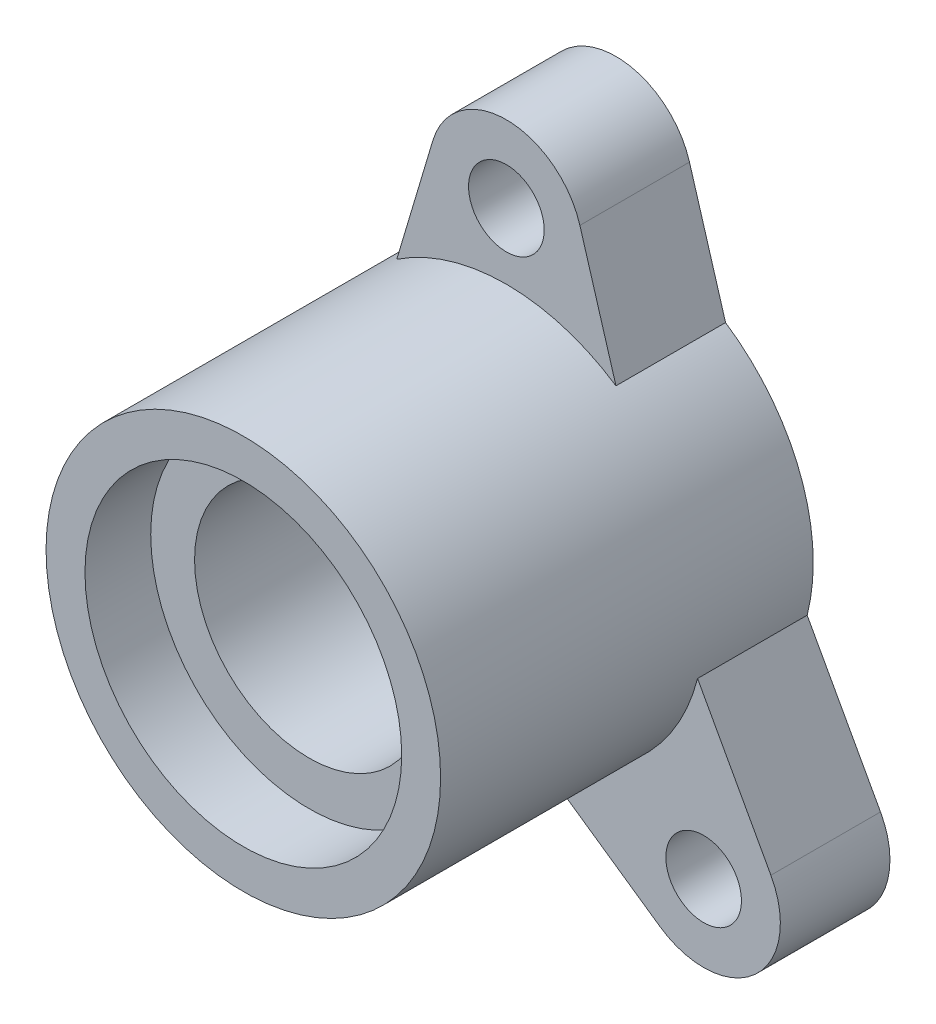
ISO-10303-21;
HEADER;
FILE_DESCRIPTION(('STEP AP214'),'2;1');
FILE_NAME('part.step','',(''),(''),'','','');
FILE_SCHEMA(('AUTOMOTIVE_DESIGN { 1 0 10303 214 1 1 1 1 }'));
ENDSEC;
DATA;
#1=APPLICATION_CONTEXT('core data for automotive mechanical design processes');
#2=APPLICATION_PROTOCOL_DEFINITION('international standard','automotive_design',2000,#1);
#3=PRODUCT_CONTEXT('',#1,'mechanical');
#4=PRODUCT('Part','Part','',(#3));
#5=PRODUCT_RELATED_PRODUCT_CATEGORY('part','',(#4));
#6=PRODUCT_DEFINITION_FORMATION('','',#4);
#7=PRODUCT_DEFINITION_CONTEXT('part definition',#1,'design');
#8=PRODUCT_DEFINITION('design','',#6,#7);
#9=PRODUCT_DEFINITION_SHAPE('','',#8);
#10=(LENGTH_UNIT() NAMED_UNIT(*) SI_UNIT(.MILLI.,.METRE.));
#11=(NAMED_UNIT(*) PLANE_ANGLE_UNIT() SI_UNIT($,.RADIAN.));
#12=(NAMED_UNIT(*) SI_UNIT($,.STERADIAN.) SOLID_ANGLE_UNIT());
#13=UNCERTAINTY_MEASURE_WITH_UNIT(LENGTH_MEASURE(1.E-05),#10,'distance_accuracy_value','');
#14=(GEOMETRIC_REPRESENTATION_CONTEXT(3) GLOBAL_UNCERTAINTY_ASSIGNED_CONTEXT((#13)) GLOBAL_UNIT_ASSIGNED_CONTEXT((#10,
#11,#12)) REPRESENTATION_CONTEXT('',''));
#15=CARTESIAN_POINT('',(0.,0.,0.));
#16=DIRECTION('',(0.,0.,1.));
#17=DIRECTION('',(1.,0.,0.));
#18=AXIS2_PLACEMENT_3D('',#15,#16,#17);
#19=CARTESIAN_POINT('',(0.,0.,5.));
#20=DIRECTION('',(0.,0.,-1.));
#21=DIRECTION('',(-1.,0.,0.));
#22=AXIS2_PLACEMENT_3D('',#19,#20,#21);
#23=CYLINDRICAL_SURFACE('',#22,5.225);
#24=CARTESIAN_POINT('',(0.,0.,0.));
#25=DIRECTION('',(0.,0.,1.));
#26=DIRECTION('',(1.,0.,0.));
#27=AXIS2_PLACEMENT_3D('',#24,#25,#26);
#28=CIRCLE('',#27,5.225);
#29=CARTESIAN_POINT('',(5.225,0.,0.));
#30=VERTEX_POINT('',#29);
#31=EDGE_CURVE('E162',#30,#30,#28,.T.);
#32=ORIENTED_EDGE('',*,*,#31,.F.);
#33=EDGE_LOOP('',(#32));
#34=FACE_BOUND('',#33,.T.);
#35=CARTESIAN_POINT('',(0.,0.,14.));
#36=DIRECTION('',(0.,0.,1.));
#37=DIRECTION('',(1.,0.,0.));
#38=AXIS2_PLACEMENT_3D('',#35,#36,#37);
#39=CIRCLE('',#38,5.225);
#40=CARTESIAN_POINT('',(5.225,0.,14.));
#41=VERTEX_POINT('',#40);
#42=EDGE_CURVE('E339',#41,#41,#39,.T.);
#43=ORIENTED_EDGE('',*,*,#42,.T.);
#44=EDGE_LOOP('',(#43));
#45=FACE_BOUND('',#44,.T.);
#46=ADVANCED_FACE('F35',(#34,#45),#23,.F.);
#47=CARTESIAN_POINT('',(0.,0.,5.));
#48=DIRECTION('',(0.,0.,1.));
#49=DIRECTION('',(1.,0.,0.));
#50=AXIS2_PLACEMENT_3D('',#47,#48,#49);
#51=PLANE('',#50);
#52=CARTESIAN_POINT('',(0.,0.,5.));
#53=DIRECTION('',(0.,0.,1.));
#54=DIRECTION('',(1.,0.,0.));
#55=AXIS2_PLACEMENT_3D('',#52,#53,#54);
#56=CIRCLE('',#55,9.);
#57=CARTESIAN_POINT('',(5.,7.48331477354788,5.));
#58=VERTEX_POINT('',#57);
#59=CARTESIAN_POINT('',(-5.,7.48331477354788,5.));
#60=VERTEX_POINT('',#59);
#61=EDGE_CURVE('E206',#58,#60,#56,.T.);
#62=ORIENTED_EDGE('',*,*,#61,.F.);
#63=DIRECTION('',(-0.285896169849848,0.958260601332011,0.));
#64=VECTOR('',#63,1.);
#65=CARTESIAN_POINT('',(3.35391210466204,13.0006365944745,5.));
#66=LINE('',#65,#64);
#67=CARTESIAN_POINT('',(3.35391210466204,13.0006365944745,5.));
#68=VERTEX_POINT('',#67);
#69=EDGE_CURVE('E201',#58,#68,#66,.T.);
#70=ORIENTED_EDGE('',*,*,#69,.T.);
#71=CARTESIAN_POINT('',(0.,12.,5.));
#72=DIRECTION('',(0.,0.,1.));
#73=DIRECTION('',(1.,0.,0.));
#74=AXIS2_PLACEMENT_3D('',#71,#72,#73);
#75=CIRCLE('',#74,3.5);
#76=CARTESIAN_POINT('',(-3.35391210466204,13.0006365944745,5.));
#77=VERTEX_POINT('',#76);
#78=EDGE_CURVE('E156',#68,#77,#75,.T.);
#79=ORIENTED_EDGE('',*,*,#78,.T.);
#80=DIRECTION('',(-0.285896169849848,-0.958260601332011,0.));
#81=VECTOR('',#80,1.);
#82=CARTESIAN_POINT('',(-3.35391210466204,13.0006365944745,5.));
#83=LINE('',#82,#81);
#84=EDGE_CURVE('E141',#77,#60,#83,.T.);
#85=ORIENTED_EDGE('',*,*,#84,.T.);
#86=EDGE_LOOP('',(#62,#70,#79,#85));
#87=FACE_BOUND('',#86,.T.);
#88=CARTESIAN_POINT('',(0.,12.,5.));
#89=DIRECTION('',(0.,0.,1.));
#90=DIRECTION('',(1.,0.,0.));
#91=AXIS2_PLACEMENT_3D('',#88,#89,#90);
#92=CIRCLE('',#91,1.725);
#93=CARTESIAN_POINT('',(1.725,12.,5.));
#94=VERTEX_POINT('',#93);
#95=EDGE_CURVE('E370',#94,#94,#92,.T.);
#96=ORIENTED_EDGE('',*,*,#95,.F.);
#97=EDGE_LOOP('',(#96));
#98=FACE_BOUND('',#97,.T.);
#99=ADVANCED_FACE('F275',(#87,#98),#51,.T.);
#100=CARTESIAN_POINT('',(-8.7225443903686,-2.21748040759083,5.));
#101=VERTEX_POINT('',#100);
#102=CARTESIAN_POINT('',(-1.28960292789694,-8.90712772381533,5.));
#103=VERTEX_POINT('',#102);
#104=EDGE_CURVE('E11',#101,#103,#56,.T.);
#105=ORIENTED_EDGE('',*,*,#104,.F.);
#106=DIRECTION('',(-0.480982245531405,-0.876730334529134,0.));
#107=VECTOR('',#106,1.);
#108=CARTESIAN_POINT('',(-8.7225443903686,-2.21748040759083,5.));
#109=LINE('',#108,#107);
#110=CARTESIAN_POINT('',(-12.068556170852,-8.31656214064008,5.));
#111=VERTEX_POINT('',#110);
#112=EDGE_CURVE('E132',#101,#111,#109,.T.);
#113=ORIENTED_EDGE('',*,*,#112,.T.);
#114=CARTESIAN_POINT('',(-9.,-10.,5.));
#115=DIRECTION('',(0.,0.,1.));
#116=DIRECTION('',(-1.,0.,0.));
#117=AXIS2_PLACEMENT_3D('',#114,#115,#116);
#118=CIRCLE('',#117,3.5);
#119=CARTESIAN_POINT('',(-7.0037492710996,-12.8748883504172,5.));
#120=VERTEX_POINT('',#119);
#121=EDGE_CURVE('E137',#111,#120,#118,.T.);
#122=ORIENTED_EDGE('',*,*,#121,.T.);
#123=DIRECTION('',(0.821396671547776,0.570357351114401,0.));
#124=VECTOR('',#123,1.);
#125=CARTESIAN_POINT('',(-1.28960292789694,-8.90712772381533,5.));
#126=LINE('',#125,#124);
#127=EDGE_CURVE('E54',#120,#103,#126,.T.);
#128=ORIENTED_EDGE('',*,*,#127,.T.);
#129=EDGE_LOOP('',(#105,#113,#122,#128));
#130=FACE_BOUND('',#129,.T.);
#131=CARTESIAN_POINT('',(-9.,-10.,5.));
#132=DIRECTION('',(0.,0.,1.));
#133=DIRECTION('',(-1.,0.,0.));
#134=AXIS2_PLACEMENT_3D('',#131,#132,#133);
#135=CIRCLE('',#134,1.725);
#136=CARTESIAN_POINT('',(-10.725,-10.,5.));
#137=VERTEX_POINT('',#136);
#138=EDGE_CURVE('E369',#137,#137,#135,.T.);
#139=ORIENTED_EDGE('',*,*,#138,.F.);
#140=EDGE_LOOP('',(#139));
#141=FACE_BOUND('',#140,.T.);
#142=ADVANCED_FACE('F134',(#130,#141),#51,.T.);
#143=CARTESIAN_POINT('',(1.28960292789694,-8.90712772381533,5.));
#144=VERTEX_POINT('',#143);
#145=CARTESIAN_POINT('',(8.7225443903686,-2.21748040759083,5.));
#146=VERTEX_POINT('',#145);
#147=EDGE_CURVE('E45',#144,#146,#56,.T.);
#148=ORIENTED_EDGE('',*,*,#147,.F.);
#149=DIRECTION('',(0.821396671547776,-0.570357351114401,0.));
#150=VECTOR('',#149,1.);
#151=CARTESIAN_POINT('',(1.28960292789694,-8.90712772381533,5.));
#152=LINE('',#151,#150);
#153=CARTESIAN_POINT('',(7.0037492710996,-12.8748883504172,5.));
#154=VERTEX_POINT('',#153);
#155=EDGE_CURVE('E181',#144,#154,#152,.T.);
#156=ORIENTED_EDGE('',*,*,#155,.T.);
#157=CARTESIAN_POINT('',(9.,-10.,5.));
#158=DIRECTION('',(0.,0.,1.));
#159=DIRECTION('',(1.,0.,0.));
#160=AXIS2_PLACEMENT_3D('',#157,#158,#159);
#161=CIRCLE('',#160,3.5);
#162=CARTESIAN_POINT('',(12.068556170852,-8.31656214064008,5.));
#163=VERTEX_POINT('',#162);
#164=EDGE_CURVE('E216',#154,#163,#161,.T.);
#165=ORIENTED_EDGE('',*,*,#164,.T.);
#166=DIRECTION('',(-0.480982245531405,0.876730334529134,0.));
#167=VECTOR('',#166,1.);
#168=CARTESIAN_POINT('',(8.7225443903686,-2.21748040759083,5.));
#169=LINE('',#168,#167);
#170=EDGE_CURVE('E214',#163,#146,#169,.T.);
#171=ORIENTED_EDGE('',*,*,#170,.T.);
#172=EDGE_LOOP('',(#148,#156,#165,#171));
#173=FACE_BOUND('',#172,.T.);
#174=CARTESIAN_POINT('',(9.,-10.,5.));
#175=DIRECTION('',(0.,0.,1.));
#176=DIRECTION('',(1.,0.,0.));
#177=AXIS2_PLACEMENT_3D('',#174,#175,#176);
#178=CIRCLE('',#177,1.725);
#179=CARTESIAN_POINT('',(10.725,-10.,5.));
#180=VERTEX_POINT('',#179);
#181=EDGE_CURVE('E300',#180,#180,#178,.T.);
#182=ORIENTED_EDGE('',*,*,#181,.F.);
#183=EDGE_LOOP('',(#182));
#184=FACE_BOUND('',#183,.T.);
#185=ADVANCED_FACE('F283',(#173,#184),#51,.T.);
#186=CARTESIAN_POINT('',(0.,0.,0.));
#187=DIRECTION('',(0.,0.,1.));
#188=DIRECTION('',(1.,0.,0.));
#189=AXIS2_PLACEMENT_3D('',#186,#187,#188);
#190=PLANE('',#189);
#191=CARTESIAN_POINT('',(-9.,-10.,0.));
#192=DIRECTION('',(0.,0.,1.));
#193=DIRECTION('',(-1.,0.,0.));
#194=AXIS2_PLACEMENT_3D('',#191,#192,#193);
#195=CIRCLE('',#194,1.725);
#196=CARTESIAN_POINT('',(-10.725,-10.,0.));
#197=VERTEX_POINT('',#196);
#198=EDGE_CURVE('E298',#197,#197,#195,.T.);
#199=ORIENTED_EDGE('',*,*,#198,.T.);
#200=EDGE_LOOP('',(#199));
#201=FACE_BOUND('',#200,.T.);
#202=ORIENTED_EDGE('',*,*,#31,.T.);
#203=EDGE_LOOP('',(#202));
#204=FACE_BOUND('',#203,.T.);
#205=CARTESIAN_POINT('',(0.,0.,0.));
#206=DIRECTION('',(0.,0.,1.));
#207=DIRECTION('',(1.,0.,0.));
#208=AXIS2_PLACEMENT_3D('',#205,#206,#207);
#209=CIRCLE('',#208,9.);
#210=CARTESIAN_POINT('',(-1.28960292789694,-8.90712772381533,0.));
#211=VERTEX_POINT('',#210);
#212=CARTESIAN_POINT('',(1.28960292789694,-8.90712772381533,0.));
#213=VERTEX_POINT('',#212);
#214=EDGE_CURVE('E158',#211,#213,#209,.T.);
#215=ORIENTED_EDGE('',*,*,#214,.F.);
#216=DIRECTION('',(0.821396671547776,0.570357351114401,0.));
#217=VECTOR('',#216,1.);
#218=CARTESIAN_POINT('',(-1.28960292789694,-8.90712772381533,0.));
#219=LINE('',#218,#217);
#220=CARTESIAN_POINT('',(-7.0037492710996,-12.8748883504172,0.));
#221=VERTEX_POINT('',#220);
#222=EDGE_CURVE('E102',#221,#211,#219,.T.);
#223=ORIENTED_EDGE('',*,*,#222,.F.);
#224=CARTESIAN_POINT('',(-9.,-10.,0.));
#225=DIRECTION('',(0.,0.,1.));
#226=DIRECTION('',(-1.,0.,0.));
#227=AXIS2_PLACEMENT_3D('',#224,#225,#226);
#228=CIRCLE('',#227,3.5);
#229=CARTESIAN_POINT('',(-12.068556170852,-8.31656214064008,0.));
#230=VERTEX_POINT('',#229);
#231=EDGE_CURVE('E96',#230,#221,#228,.T.);
#232=ORIENTED_EDGE('',*,*,#231,.F.);
#233=DIRECTION('',(-0.480982245531405,-0.876730334529134,0.));
#234=VECTOR('',#233,1.);
#235=CARTESIAN_POINT('',(-8.7225443903686,-2.21748040759083,0.));
#236=LINE('',#235,#234);
#237=CARTESIAN_POINT('',(-8.7225443903686,-2.21748040759083,0.));
#238=VERTEX_POINT('',#237);
#239=EDGE_CURVE('E146',#238,#230,#236,.T.);
#240=ORIENTED_EDGE('',*,*,#239,.F.);
#241=CARTESIAN_POINT('',(0.,0.,0.));
#242=DIRECTION('',(0.,0.,1.));
#243=DIRECTION('',(1.,0.,0.));
#244=AXIS2_PLACEMENT_3D('',#241,#242,#243);
#245=CIRCLE('',#244,9.);
#246=CARTESIAN_POINT('',(-5.,7.48331477354788,0.));
#247=VERTEX_POINT('',#246);
#248=EDGE_CURVE('E176',#247,#238,#245,.T.);
#249=ORIENTED_EDGE('',*,*,#248,.F.);
#250=DIRECTION('',(-0.285896169849848,-0.958260601332011,0.));
#251=VECTOR('',#250,1.);
#252=CARTESIAN_POINT('',(-3.35391210466204,13.0006365944745,0.));
#253=LINE('',#252,#251);
#254=CARTESIAN_POINT('',(-3.35391210466204,13.0006365944745,0.));
#255=VERTEX_POINT('',#254);
#256=EDGE_CURVE('E174',#255,#247,#253,.T.);
#257=ORIENTED_EDGE('',*,*,#256,.F.);
#258=CARTESIAN_POINT('',(0.,12.,0.));
#259=DIRECTION('',(0.,0.,1.));
#260=DIRECTION('',(1.,0.,0.));
#261=AXIS2_PLACEMENT_3D('',#258,#259,#260);
#262=CIRCLE('',#261,3.5);
#263=CARTESIAN_POINT('',(3.35391210466204,13.0006365944745,0.));
#264=VERTEX_POINT('',#263);
#265=EDGE_CURVE('E172',#264,#255,#262,.T.);
#266=ORIENTED_EDGE('',*,*,#265,.F.);
#267=DIRECTION('',(-0.285896169849848,0.958260601332011,0.));
#268=VECTOR('',#267,1.);
#269=CARTESIAN_POINT('',(3.35391210466204,13.0006365944745,0.));
#270=LINE('',#269,#268);
#271=CARTESIAN_POINT('',(5.,7.48331477354788,0.));
#272=VERTEX_POINT('',#271);
#273=EDGE_CURVE('E170',#272,#264,#270,.T.);
#274=ORIENTED_EDGE('',*,*,#273,.F.);
#275=CARTESIAN_POINT('',(0.,0.,0.));
#276=DIRECTION('',(0.,0.,1.));
#277=DIRECTION('',(1.,0.,0.));
#278=AXIS2_PLACEMENT_3D('',#275,#276,#277);
#279=CIRCLE('',#278,9.);
#280=CARTESIAN_POINT('',(8.7225443903686,-2.21748040759083,0.));
#281=VERTEX_POINT('',#280);
#282=EDGE_CURVE('E168',#281,#272,#279,.T.);
#283=ORIENTED_EDGE('',*,*,#282,.F.);
#284=DIRECTION('',(-0.480982245531405,0.876730334529134,0.));
#285=VECTOR('',#284,1.);
#286=CARTESIAN_POINT('',(8.7225443903686,-2.21748040759083,0.));
#287=LINE('',#286,#285);
#288=CARTESIAN_POINT('',(12.068556170852,-8.31656214064008,0.));
#289=VERTEX_POINT('',#288);
#290=EDGE_CURVE('E166',#289,#281,#287,.T.);
#291=ORIENTED_EDGE('',*,*,#290,.F.);
#292=CARTESIAN_POINT('',(9.,-10.,0.));
#293=DIRECTION('',(0.,0.,1.));
#294=DIRECTION('',(1.,0.,0.));
#295=AXIS2_PLACEMENT_3D('',#292,#293,#294);
#296=CIRCLE('',#295,3.5);
#297=CARTESIAN_POINT('',(7.0037492710996,-12.8748883504172,0.));
#298=VERTEX_POINT('',#297);
#299=EDGE_CURVE('E164',#298,#289,#296,.T.);
#300=ORIENTED_EDGE('',*,*,#299,.F.);
#301=DIRECTION('',(0.821396671547776,-0.570357351114401,0.));
#302=VECTOR('',#301,1.);
#303=CARTESIAN_POINT('',(1.28960292789694,-8.90712772381533,0.));
#304=LINE('',#303,#302);
#305=EDGE_CURVE('E161',#213,#298,#304,.T.);
#306=ORIENTED_EDGE('',*,*,#305,.F.);
#307=EDGE_LOOP('',(#215,#223,#232,#240,#249,#257,#266,#274,#283,#291,#300,#306));
#308=FACE_BOUND('',#307,.T.);
#309=CARTESIAN_POINT('',(9.,-10.,0.));
#310=DIRECTION('',(0.,0.,1.));
#311=DIRECTION('',(1.,0.,0.));
#312=AXIS2_PLACEMENT_3D('',#309,#310,#311);
#313=CIRCLE('',#312,1.725);
#314=CARTESIAN_POINT('',(10.725,-10.,0.));
#315=VERTEX_POINT('',#314);
#316=EDGE_CURVE('E303',#315,#315,#313,.T.);
#317=ORIENTED_EDGE('',*,*,#316,.T.);
#318=EDGE_LOOP('',(#317));
#319=FACE_BOUND('',#318,.T.);
#320=CARTESIAN_POINT('',(0.,12.,0.));
#321=DIRECTION('',(0.,0.,1.));
#322=DIRECTION('',(1.,0.,0.));
#323=AXIS2_PLACEMENT_3D('',#320,#321,#322);
#324=CIRCLE('',#323,1.725);
#325=CARTESIAN_POINT('',(1.725,12.,0.));
#326=VERTEX_POINT('',#325);
#327=EDGE_CURVE('E332',#326,#326,#324,.T.);
#328=ORIENTED_EDGE('',*,*,#327,.T.);
#329=EDGE_LOOP('',(#328));
#330=FACE_BOUND('',#329,.T.);
#331=ADVANCED_FACE('F256',(#201,#204,#308,#319,#330),#190,.F.);
#332=CARTESIAN_POINT('',(1.28960292789694,-8.90712772381533,5.));
#333=DIRECTION('',(0.570357351114401,0.821396671547776,0.));
#334=DIRECTION('',(-0.821396671547776,0.570357351114401,0.));
#335=AXIS2_PLACEMENT_3D('',#332,#333,#334);
#336=PLANE('',#335);
#337=ORIENTED_EDGE('',*,*,#305,.T.);
#338=DIRECTION('',(0.,0.,-1.));
#339=VECTOR('',#338,1.);
#340=CARTESIAN_POINT('',(7.0037492710996,-12.8748883504172,5.));
#341=LINE('',#340,#339);
#342=EDGE_CURVE('E194',#154,#298,#341,.T.);
#343=ORIENTED_EDGE('',*,*,#342,.F.);
#344=ORIENTED_EDGE('',*,*,#155,.F.);
#345=DIRECTION('',(0.,0.,-1.));
#346=VECTOR('',#345,1.);
#347=CARTESIAN_POINT('',(1.28960292789694,-8.90712772381533,5.));
#348=LINE('',#347,#346);
#349=EDGE_CURVE('E198',#144,#213,#348,.T.);
#350=ORIENTED_EDGE('',*,*,#349,.T.);
#351=EDGE_LOOP('',(#337,#343,#344,#350));
#352=FACE_BOUND('',#351,.T.);
#353=ADVANCED_FACE('F37',(#352),#336,.F.);
#354=CARTESIAN_POINT('',(9.,-10.,5.));
#355=DIRECTION('',(0.,0.,-1.));
#356=DIRECTION('',(-1.,0.,0.));
#357=AXIS2_PLACEMENT_3D('',#354,#355,#356);
#358=CYLINDRICAL_SURFACE('',#357,3.5);
#359=ORIENTED_EDGE('',*,*,#299,.T.);
#360=DIRECTION('',(0.,0.,-1.));
#361=VECTOR('',#360,1.);
#362=CARTESIAN_POINT('',(12.068556170852,-8.31656214064008,5.));
#363=LINE('',#362,#361);
#364=EDGE_CURVE('E191',#163,#289,#363,.T.);
#365=ORIENTED_EDGE('',*,*,#364,.F.);
#366=ORIENTED_EDGE('',*,*,#164,.F.);
#367=ORIENTED_EDGE('',*,*,#342,.T.);
#368=EDGE_LOOP('',(#359,#365,#366,#367));
#369=FACE_BOUND('',#368,.T.);
#370=ADVANCED_FACE('F293',(#369),#358,.T.);
#371=CARTESIAN_POINT('',(8.7225443903686,-2.21748040759083,5.));
#372=DIRECTION('',(-0.876730334529134,-0.480982245531405,0.));
#373=DIRECTION('',(0.480982245531405,-0.876730334529134,0.));
#374=AXIS2_PLACEMENT_3D('',#371,#372,#373);
#375=PLANE('',#374);
#376=ORIENTED_EDGE('',*,*,#290,.T.);
#377=DIRECTION('',(0.,0.,-1.));
#378=VECTOR('',#377,1.);
#379=CARTESIAN_POINT('',(8.7225443903686,-2.21748040759083,5.));
#380=LINE('',#379,#378);
#381=EDGE_CURVE('E195',#146,#281,#380,.T.);
#382=ORIENTED_EDGE('',*,*,#381,.F.);
#383=ORIENTED_EDGE('',*,*,#170,.F.);
#384=ORIENTED_EDGE('',*,*,#364,.T.);
#385=EDGE_LOOP('',(#376,#382,#383,#384));
#386=FACE_BOUND('',#385,.T.);
#387=ADVANCED_FACE('F315',(#386),#375,.F.);
#388=CARTESIAN_POINT('',(3.35391210466204,13.0006365944745,5.));
#389=DIRECTION('',(-0.958260601332011,-0.285896169849848,0.));
#390=DIRECTION('',(0.285896169849848,-0.958260601332011,0.));
#391=AXIS2_PLACEMENT_3D('',#388,#389,#390);
#392=PLANE('',#391);
#393=ORIENTED_EDGE('',*,*,#273,.T.);
#394=DIRECTION('',(0.,0.,-1.));
#395=VECTOR('',#394,1.);
#396=CARTESIAN_POINT('',(3.35391210466204,13.0006365944745,5.));
#397=LINE('',#396,#395);
#398=EDGE_CURVE('E186',#68,#264,#397,.T.);
#399=ORIENTED_EDGE('',*,*,#398,.F.);
#400=ORIENTED_EDGE('',*,*,#69,.F.);
#401=DIRECTION('',(0.,0.,-1.));
#402=VECTOR('',#401,1.);
#403=CARTESIAN_POINT('',(5.,7.48331477354788,5.));
#404=LINE('',#403,#402);
#405=EDGE_CURVE('E190',#58,#272,#404,.T.);
#406=ORIENTED_EDGE('',*,*,#405,.T.);
#407=EDGE_LOOP('',(#393,#399,#400,#406));
#408=FACE_BOUND('',#407,.T.);
#409=ADVANCED_FACE('F321',(#408),#392,.F.);
#410=CARTESIAN_POINT('',(0.,12.,5.));
#411=DIRECTION('',(0.,0.,-1.));
#412=DIRECTION('',(-1.,0.,0.));
#413=AXIS2_PLACEMENT_3D('',#410,#411,#412);
#414=CYLINDRICAL_SURFACE('',#413,3.5);
#415=ORIENTED_EDGE('',*,*,#265,.T.);
#416=DIRECTION('',(0.,0.,-1.));
#417=VECTOR('',#416,1.);
#418=CARTESIAN_POINT('',(-3.35391210466204,13.0006365944745,5.));
#419=LINE('',#418,#417);
#420=EDGE_CURVE('E183',#77,#255,#419,.T.);
#421=ORIENTED_EDGE('',*,*,#420,.F.);
#422=ORIENTED_EDGE('',*,*,#78,.F.);
#423=ORIENTED_EDGE('',*,*,#398,.T.);
#424=EDGE_LOOP('',(#415,#421,#422,#423));
#425=FACE_BOUND('',#424,.T.);
#426=ADVANCED_FACE('F325',(#425),#414,.T.);
#427=CARTESIAN_POINT('',(-3.35391210466204,13.0006365944745,5.));
#428=DIRECTION('',(0.958260601332011,-0.285896169849848,0.));
#429=DIRECTION('',(0.285896169849848,0.958260601332011,0.));
#430=AXIS2_PLACEMENT_3D('',#427,#428,#429);
#431=PLANE('',#430);
#432=ORIENTED_EDGE('',*,*,#256,.T.);
#433=DIRECTION('',(0.,0.,-1.));
#434=VECTOR('',#433,1.);
#435=CARTESIAN_POINT('',(-5.,7.48331477354788,5.));
#436=LINE('',#435,#434);
#437=EDGE_CURVE('E187',#60,#247,#436,.T.);
#438=ORIENTED_EDGE('',*,*,#437,.F.);
#439=ORIENTED_EDGE('',*,*,#84,.F.);
#440=ORIENTED_EDGE('',*,*,#420,.T.);
#441=EDGE_LOOP('',(#432,#438,#439,#440));
#442=FACE_BOUND('',#441,.T.);
#443=ADVANCED_FACE('F424',(#442),#431,.F.);
#444=CARTESIAN_POINT('',(0.,0.,5.));
#445=DIRECTION('',(0.,0.,-1.));
#446=DIRECTION('',(-1.,0.,0.));
#447=AXIS2_PLACEMENT_3D('',#444,#445,#446);
#448=CYLINDRICAL_SURFACE('',#447,9.);
#449=ORIENTED_EDGE('',*,*,#248,.T.);
#450=DIRECTION('',(0.,0.,-1.));
#451=VECTOR('',#450,1.);
#452=CARTESIAN_POINT('',(-8.7225443903686,-2.21748040759083,5.));
#453=LINE('',#452,#451);
#454=EDGE_CURVE('E147',#101,#238,#453,.T.);
#455=ORIENTED_EDGE('',*,*,#454,.F.);
#456=ORIENTED_EDGE('',*,*,#104,.T.);
#457=DIRECTION('',(0.,0.,-1.));
#458=VECTOR('',#457,1.);
#459=CARTESIAN_POINT('',(-1.28960292789694,-8.90712772381533,5.));
#460=LINE('',#459,#458);
#461=EDGE_CURVE('E152',#103,#211,#460,.T.);
#462=ORIENTED_EDGE('',*,*,#461,.T.);
#463=ORIENTED_EDGE('',*,*,#214,.T.);
#464=ORIENTED_EDGE('',*,*,#349,.F.);
#465=ORIENTED_EDGE('',*,*,#147,.T.);
#466=ORIENTED_EDGE('',*,*,#381,.T.);
#467=ORIENTED_EDGE('',*,*,#282,.T.);
#468=ORIENTED_EDGE('',*,*,#405,.F.);
#469=ORIENTED_EDGE('',*,*,#61,.T.);
#470=ORIENTED_EDGE('',*,*,#437,.T.);
#471=EDGE_LOOP('',(#449,#455,#456,#462,#463,#464,#465,#466,#467,#468,#469,#470));
#472=FACE_BOUND('',#471,.T.);
#473=CARTESIAN_POINT('',(0.,0.,17.));
#474=DIRECTION('',(0.,0.,1.));
#475=DIRECTION('',(1.,0.,0.));
#476=AXIS2_PLACEMENT_3D('',#473,#474,#475);
#477=CIRCLE('',#476,9.);
#478=CARTESIAN_POINT('',(9.,0.,17.));
#479=VERTEX_POINT('',#478);
#480=EDGE_CURVE('E329',#479,#479,#477,.T.);
#481=ORIENTED_EDGE('',*,*,#480,.F.);
#482=EDGE_LOOP('',(#481));
#483=FACE_BOUND('',#482,.T.);
#484=ADVANCED_FACE('F247',(#472,#483),#448,.T.);
#485=CARTESIAN_POINT('',(-8.7225443903686,-2.21748040759083,5.));
#486=DIRECTION('',(0.876730334529134,-0.480982245531405,0.));
#487=DIRECTION('',(0.480982245531405,0.876730334529134,0.));
#488=AXIS2_PLACEMENT_3D('',#485,#486,#487);
#489=PLANE('',#488);
#490=ORIENTED_EDGE('',*,*,#239,.T.);
#491=DIRECTION('',(0.,0.,-1.));
#492=VECTOR('',#491,1.);
#493=CARTESIAN_POINT('',(-12.068556170852,-8.31656214064008,5.));
#494=LINE('',#493,#492);
#495=EDGE_CURVE('E143',#111,#230,#494,.T.);
#496=ORIENTED_EDGE('',*,*,#495,.F.);
#497=ORIENTED_EDGE('',*,*,#112,.F.);
#498=ORIENTED_EDGE('',*,*,#454,.T.);
#499=EDGE_LOOP('',(#490,#496,#497,#498));
#500=FACE_BOUND('',#499,.T.);
#501=ADVANCED_FACE('F144',(#500),#489,.F.);
#502=CARTESIAN_POINT('',(-9.,-10.,5.));
#503=DIRECTION('',(0.,0.,-1.));
#504=DIRECTION('',(-1.,0.,0.));
#505=AXIS2_PLACEMENT_3D('',#502,#503,#504);
#506=CYLINDRICAL_SURFACE('',#505,3.5);
#507=ORIENTED_EDGE('',*,*,#231,.T.);
#508=DIRECTION('',(0.,0.,-1.));
#509=VECTOR('',#508,1.);
#510=CARTESIAN_POINT('',(-7.0037492710996,-12.8748883504172,5.));
#511=LINE('',#510,#509);
#512=EDGE_CURVE('E148',#120,#221,#511,.T.);
#513=ORIENTED_EDGE('',*,*,#512,.F.);
#514=ORIENTED_EDGE('',*,*,#121,.F.);
#515=ORIENTED_EDGE('',*,*,#495,.T.);
#516=EDGE_LOOP('',(#507,#513,#514,#515));
#517=FACE_BOUND('',#516,.T.);
#518=ADVANCED_FACE('F150',(#517),#506,.T.);
#519=CARTESIAN_POINT('',(-1.28960292789694,-8.90712772381533,5.));
#520=DIRECTION('',(-0.570357351114401,0.821396671547776,0.));
#521=DIRECTION('',(-0.821396671547776,-0.570357351114401,0.));
#522=AXIS2_PLACEMENT_3D('',#519,#520,#521);
#523=PLANE('',#522);
#524=ORIENTED_EDGE('',*,*,#222,.T.);
#525=ORIENTED_EDGE('',*,*,#461,.F.);
#526=ORIENTED_EDGE('',*,*,#127,.F.);
#527=ORIENTED_EDGE('',*,*,#512,.T.);
#528=EDGE_LOOP('',(#524,#525,#526,#527));
#529=FACE_BOUND('',#528,.T.);
#530=ADVANCED_FACE('F261',(#529),#523,.F.);
#531=CARTESIAN_POINT('',(9.,-10.,5.));
#532=DIRECTION('',(0.,0.,-1.));
#533=DIRECTION('',(-1.,0.,0.));
#534=AXIS2_PLACEMENT_3D('',#531,#532,#533);
#535=CYLINDRICAL_SURFACE('',#534,1.725);
#536=ORIENTED_EDGE('',*,*,#181,.T.);
#537=EDGE_LOOP('',(#536));
#538=FACE_BOUND('',#537,.T.);
#539=ORIENTED_EDGE('',*,*,#316,.F.);
#540=EDGE_LOOP('',(#539));
#541=FACE_BOUND('',#540,.T.);
#542=ADVANCED_FACE('F263',(#538,#541),#535,.F.);
#543=CARTESIAN_POINT('',(-9.,-10.,5.));
#544=DIRECTION('',(0.,0.,-1.));
#545=DIRECTION('',(-1.,0.,0.));
#546=AXIS2_PLACEMENT_3D('',#543,#544,#545);
#547=CYLINDRICAL_SURFACE('',#546,1.725);
#548=ORIENTED_EDGE('',*,*,#138,.T.);
#549=EDGE_LOOP('',(#548));
#550=FACE_BOUND('',#549,.T.);
#551=ORIENTED_EDGE('',*,*,#198,.F.);
#552=EDGE_LOOP('',(#551));
#553=FACE_BOUND('',#552,.T.);
#554=ADVANCED_FACE('F269',(#550,#553),#547,.F.);
#555=CARTESIAN_POINT('',(0.,12.,5.));
#556=DIRECTION('',(0.,0.,-1.));
#557=DIRECTION('',(-1.,0.,0.));
#558=AXIS2_PLACEMENT_3D('',#555,#556,#557);
#559=CYLINDRICAL_SURFACE('',#558,1.725);
#560=ORIENTED_EDGE('',*,*,#95,.T.);
#561=EDGE_LOOP('',(#560));
#562=FACE_BOUND('',#561,.T.);
#563=ORIENTED_EDGE('',*,*,#327,.F.);
#564=EDGE_LOOP('',(#563));
#565=FACE_BOUND('',#564,.T.);
#566=ADVANCED_FACE('F358',(#562,#565),#559,.F.);
#567=CARTESIAN_POINT('',(0.,0.,17.));
#568=DIRECTION('',(0.,0.,1.));
#569=DIRECTION('',(1.,0.,0.));
#570=AXIS2_PLACEMENT_3D('',#567,#568,#569);
#571=PLANE('',#570);
#572=CARTESIAN_POINT('',(0.,0.,17.));
#573=DIRECTION('',(0.,0.,1.));
#574=DIRECTION('',(1.,0.,0.));
#575=AXIS2_PLACEMENT_3D('',#572,#573,#574);
#576=CIRCLE('',#575,7.225);
#577=CARTESIAN_POINT('',(7.225,0.,17.));
#578=VERTEX_POINT('',#577);
#579=EDGE_CURVE('E334',#578,#578,#576,.T.);
#580=ORIENTED_EDGE('',*,*,#579,.F.);
#581=EDGE_LOOP('',(#580));
#582=FACE_BOUND('',#581,.T.);
#583=ORIENTED_EDGE('',*,*,#480,.T.);
#584=EDGE_LOOP('',(#583));
#585=FACE_BOUND('',#584,.T.);
#586=ADVANCED_FACE('F352',(#582,#585),#571,.T.);
#587=CARTESIAN_POINT('',(0.,0.,14.));
#588=DIRECTION('',(0.,0.,1.));
#589=DIRECTION('',(1.,0.,0.));
#590=AXIS2_PLACEMENT_3D('',#587,#588,#589);
#591=CYLINDRICAL_SURFACE('',#590,7.225);
#592=CARTESIAN_POINT('',(0.,0.,14.));
#593=DIRECTION('',(0.,0.,1.));
#594=DIRECTION('',(1.,0.,0.));
#595=AXIS2_PLACEMENT_3D('',#592,#593,#594);
#596=CIRCLE('',#595,7.225);
#597=CARTESIAN_POINT('',(7.225,0.,14.));
#598=VERTEX_POINT('',#597);
#599=EDGE_CURVE('E330',#598,#598,#596,.T.);
#600=ORIENTED_EDGE('',*,*,#599,.F.);
#601=EDGE_LOOP('',(#600));
#602=FACE_BOUND('',#601,.T.);
#603=ORIENTED_EDGE('',*,*,#579,.T.);
#604=EDGE_LOOP('',(#603));
#605=FACE_BOUND('',#604,.T.);
#606=ADVANCED_FACE('F347',(#602,#605),#591,.F.);
#607=CARTESIAN_POINT('',(0.,0.,14.));
#608=DIRECTION('',(0.,0.,1.));
#609=DIRECTION('',(1.,0.,0.));
#610=AXIS2_PLACEMENT_3D('',#607,#608,#609);
#611=PLANE('',#610);
#612=ORIENTED_EDGE('',*,*,#42,.F.);
#613=EDGE_LOOP('',(#612));
#614=FACE_BOUND('',#613,.T.);
#615=ORIENTED_EDGE('',*,*,#599,.T.);
#616=EDGE_LOOP('',(#615));
#617=FACE_BOUND('',#616,.T.);
#618=ADVANCED_FACE('F345',(#614,#617),#611,.T.);
#619=CLOSED_SHELL('',(#46,#99,#142,#185,#331,#353,#370,#387,#409,#426,#443,#484,#501,#518,#530,
#542,#554,#566,#586,#606,#618));
#620=MANIFOLD_SOLID_BREP('B2',#619);
#621=ADVANCED_BREP_SHAPE_REPRESENTATION('',(#18,#620),#14);
#622=SHAPE_DEFINITION_REPRESENTATION(#9,#621);
ENDSEC;
END-ISO-10303-21;
